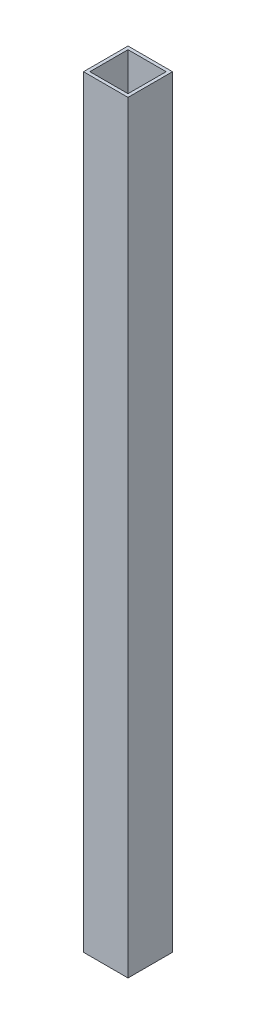
ISO-10303-21;
HEADER;
FILE_DESCRIPTION(('STEP AP214'),'2;1');
FILE_NAME('part.step','',(''),(''),'','','');
FILE_SCHEMA(('AUTOMOTIVE_DESIGN { 1 0 10303 214 1 1 1 1 }'));
ENDSEC;
DATA;
#1=APPLICATION_CONTEXT('core data for automotive mechanical design processes');
#2=APPLICATION_PROTOCOL_DEFINITION('international standard','automotive_design',2000,#1);
#3=PRODUCT_CONTEXT('',#1,'mechanical');
#4=PRODUCT('Part','Part','',(#3));
#5=PRODUCT_RELATED_PRODUCT_CATEGORY('part','',(#4));
#6=PRODUCT_DEFINITION_FORMATION('','',#4);
#7=PRODUCT_DEFINITION_CONTEXT('part definition',#1,'design');
#8=PRODUCT_DEFINITION('design','',#6,#7);
#9=PRODUCT_DEFINITION_SHAPE('','',#8);
#10=(LENGTH_UNIT() NAMED_UNIT(*) SI_UNIT(.MILLI.,.METRE.));
#11=(NAMED_UNIT(*) PLANE_ANGLE_UNIT() SI_UNIT($,.RADIAN.));
#12=(NAMED_UNIT(*) SI_UNIT($,.STERADIAN.) SOLID_ANGLE_UNIT());
#13=UNCERTAINTY_MEASURE_WITH_UNIT(LENGTH_MEASURE(1.E-05),#10,'distance_accuracy_value','');
#14=(GEOMETRIC_REPRESENTATION_CONTEXT(3) GLOBAL_UNCERTAINTY_ASSIGNED_CONTEXT((#13)) GLOBAL_UNIT_ASSIGNED_CONTEXT((#10,
#11,#12)) REPRESENTATION_CONTEXT('',''));
#15=CARTESIAN_POINT('',(0.,0.,0.));
#16=DIRECTION('',(0.,0.,1.));
#17=DIRECTION('',(1.,0.,0.));
#18=AXIS2_PLACEMENT_3D('',#15,#16,#17);
#19=CARTESIAN_POINT('',(22.225,0.,22.225));
#20=DIRECTION('',(1.,0.,0.));
#21=DIRECTION('',(0.,0.,-1.));
#22=AXIS2_PLACEMENT_3D('',#19,#20,#21);
#23=PLANE('',#22);
#24=DIRECTION('',(0.,1.,0.));
#25=VECTOR('',#24,1.);
#26=CARTESIAN_POINT('',(22.225,0.,22.225));
#27=LINE('',#26,#25);
#28=CARTESIAN_POINT('',(22.225,0.,22.225));
#29=VERTEX_POINT('',#28);
#30=CARTESIAN_POINT('',(22.225,762.,22.225));
#31=VERTEX_POINT('',#30);
#32=EDGE_CURVE('E113',#29,#31,#27,.T.);
#33=ORIENTED_EDGE('',*,*,#32,.F.);
#34=DIRECTION('',(0.,0.,1.));
#35=VECTOR('',#34,1.);
#36=CARTESIAN_POINT('',(22.225,0.,0.));
#37=LINE('',#36,#35);
#38=CARTESIAN_POINT('',(22.225,0.,-22.225));
#39=VERTEX_POINT('',#38);
#40=EDGE_CURVE('E135',#29,#39,#37,.F.);
#41=ORIENTED_EDGE('',*,*,#40,.T.);
#42=DIRECTION('',(0.,1.,0.));
#43=VECTOR('',#42,1.);
#44=CARTESIAN_POINT('',(22.225,0.,-22.225));
#45=LINE('',#44,#43);
#46=CARTESIAN_POINT('',(22.225,762.,-22.225));
#47=VERTEX_POINT('',#46);
#48=EDGE_CURVE('E130',#47,#39,#45,.F.);
#49=ORIENTED_EDGE('',*,*,#48,.F.);
#50=DIRECTION('',(0.,0.,1.));
#51=VECTOR('',#50,1.);
#52=CARTESIAN_POINT('',(22.225,762.,0.));
#53=LINE('',#52,#51);
#54=EDGE_CURVE('E105',#31,#47,#53,.F.);
#55=ORIENTED_EDGE('',*,*,#54,.F.);
#56=EDGE_LOOP('',(#33,#41,#49,#55));
#57=FACE_BOUND('',#56,.T.);
#58=ADVANCED_FACE('F16',(#57),#23,.T.);
#59=CARTESIAN_POINT('',(-19.05,0.,-19.05));
#60=DIRECTION('',(0.,0.,1.));
#61=DIRECTION('',(1.,0.,0.));
#62=AXIS2_PLACEMENT_3D('',#59,#60,#61);
#63=PLANE('',#62);
#64=DIRECTION('',(0.,1.,0.));
#65=VECTOR('',#64,1.);
#66=CARTESIAN_POINT('',(-19.05,0.,-19.05));
#67=LINE('',#66,#65);
#68=CARTESIAN_POINT('',(-19.05,0.,-19.05));
#69=VERTEX_POINT('',#68);
#70=CARTESIAN_POINT('',(-19.05,762.,-19.05));
#71=VERTEX_POINT('',#70);
#72=EDGE_CURVE('E90',#69,#71,#67,.T.);
#73=ORIENTED_EDGE('',*,*,#72,.F.);
#74=DIRECTION('',(1.,0.,0.));
#75=VECTOR('',#74,1.);
#76=CARTESIAN_POINT('',(0.,0.,-19.05));
#77=LINE('',#76,#75);
#78=CARTESIAN_POINT('',(19.05,0.,-19.05));
#79=VERTEX_POINT('',#78);
#80=EDGE_CURVE('E138',#69,#79,#77,.T.);
#81=ORIENTED_EDGE('',*,*,#80,.T.);
#82=DIRECTION('',(0.,1.,0.));
#83=VECTOR('',#82,1.);
#84=CARTESIAN_POINT('',(19.05,0.,-19.05));
#85=LINE('',#84,#83);
#86=CARTESIAN_POINT('',(19.05,762.,-19.05));
#87=VERTEX_POINT('',#86);
#88=EDGE_CURVE('E19',#87,#79,#85,.F.);
#89=ORIENTED_EDGE('',*,*,#88,.F.);
#90=DIRECTION('',(1.,0.,0.));
#91=VECTOR('',#90,1.);
#92=CARTESIAN_POINT('',(0.,762.,-19.05));
#93=LINE('',#92,#91);
#94=EDGE_CURVE('E104',#71,#87,#93,.T.);
#95=ORIENTED_EDGE('',*,*,#94,.F.);
#96=EDGE_LOOP('',(#73,#81,#89,#95));
#97=FACE_BOUND('',#96,.T.);
#98=ADVANCED_FACE('F124',(#97),#63,.T.);
#99=CARTESIAN_POINT('',(19.05,0.,-19.05));
#100=DIRECTION('',(-1.,0.,0.));
#101=DIRECTION('',(0.,0.,1.));
#102=AXIS2_PLACEMENT_3D('',#99,#100,#101);
#103=PLANE('',#102);
#104=ORIENTED_EDGE('',*,*,#88,.T.);
#105=DIRECTION('',(0.,0.,1.));
#106=VECTOR('',#105,1.);
#107=CARTESIAN_POINT('',(19.05,0.,0.));
#108=LINE('',#107,#106);
#109=CARTESIAN_POINT('',(19.05,0.,19.05));
#110=VERTEX_POINT('',#109);
#111=EDGE_CURVE('E87',#79,#110,#108,.T.);
#112=ORIENTED_EDGE('',*,*,#111,.T.);
#113=DIRECTION('',(0.,1.,0.));
#114=VECTOR('',#113,1.);
#115=CARTESIAN_POINT('',(19.05,0.,19.05));
#116=LINE('',#115,#114);
#117=CARTESIAN_POINT('',(19.05,762.,19.05));
#118=VERTEX_POINT('',#117);
#119=EDGE_CURVE('E79',#118,#110,#116,.F.);
#120=ORIENTED_EDGE('',*,*,#119,.F.);
#121=DIRECTION('',(0.,0.,1.));
#122=VECTOR('',#121,1.);
#123=CARTESIAN_POINT('',(19.05,762.,0.));
#124=LINE('',#123,#122);
#125=EDGE_CURVE('E84',#87,#118,#124,.T.);
#126=ORIENTED_EDGE('',*,*,#125,.F.);
#127=EDGE_LOOP('',(#104,#112,#120,#126));
#128=FACE_BOUND('',#127,.T.);
#129=ADVANCED_FACE('F82',(#128),#103,.T.);
#130=CARTESIAN_POINT('',(19.05,0.,19.05));
#131=DIRECTION('',(0.,0.,-1.));
#132=DIRECTION('',(-1.,0.,0.));
#133=AXIS2_PLACEMENT_3D('',#130,#131,#132);
#134=PLANE('',#133);
#135=ORIENTED_EDGE('',*,*,#119,.T.);
#136=DIRECTION('',(1.,0.,0.));
#137=VECTOR('',#136,1.);
#138=CARTESIAN_POINT('',(0.,0.,19.05));
#139=LINE('',#138,#137);
#140=CARTESIAN_POINT('',(-19.05,0.,19.05));
#141=VERTEX_POINT('',#140);
#142=EDGE_CURVE('E141',#110,#141,#139,.F.);
#143=ORIENTED_EDGE('',*,*,#142,.T.);
#144=DIRECTION('',(0.,1.,0.));
#145=VECTOR('',#144,1.);
#146=CARTESIAN_POINT('',(-19.05,0.,19.05));
#147=LINE('',#146,#145);
#148=CARTESIAN_POINT('',(-19.05,762.,19.05));
#149=VERTEX_POINT('',#148);
#150=EDGE_CURVE('E95',#149,#141,#147,.F.);
#151=ORIENTED_EDGE('',*,*,#150,.F.);
#152=DIRECTION('',(1.,0.,0.));
#153=VECTOR('',#152,1.);
#154=CARTESIAN_POINT('',(0.,762.,19.05));
#155=LINE('',#154,#153);
#156=EDGE_CURVE('E92',#118,#149,#155,.F.);
#157=ORIENTED_EDGE('',*,*,#156,.F.);
#158=EDGE_LOOP('',(#135,#143,#151,#157));
#159=FACE_BOUND('',#158,.T.);
#160=ADVANCED_FACE('F93',(#159),#134,.T.);
#161=CARTESIAN_POINT('',(-19.05,0.,19.05));
#162=DIRECTION('',(1.,0.,0.));
#163=DIRECTION('',(0.,0.,-1.));
#164=AXIS2_PLACEMENT_3D('',#161,#162,#163);
#165=PLANE('',#164);
#166=ORIENTED_EDGE('',*,*,#150,.T.);
#167=DIRECTION('',(0.,0.,1.));
#168=VECTOR('',#167,1.);
#169=CARTESIAN_POINT('',(-19.05,0.,0.));
#170=LINE('',#169,#168);
#171=EDGE_CURVE('E121',#141,#69,#170,.F.);
#172=ORIENTED_EDGE('',*,*,#171,.T.);
#173=ORIENTED_EDGE('',*,*,#72,.T.);
#174=DIRECTION('',(0.,0.,1.));
#175=VECTOR('',#174,1.);
#176=CARTESIAN_POINT('',(-19.05,762.,0.));
#177=LINE('',#176,#175);
#178=EDGE_CURVE('E99',#149,#71,#177,.F.);
#179=ORIENTED_EDGE('',*,*,#178,.F.);
#180=EDGE_LOOP('',(#166,#172,#173,#179));
#181=FACE_BOUND('',#180,.T.);
#182=ADVANCED_FACE('F119',(#181),#165,.T.);
#183=CARTESIAN_POINT('',(-22.225,0.,22.225));
#184=DIRECTION('',(0.,0.,1.));
#185=DIRECTION('',(1.,0.,0.));
#186=AXIS2_PLACEMENT_3D('',#183,#184,#185);
#187=PLANE('',#186);
#188=DIRECTION('',(0.,1.,0.));
#189=VECTOR('',#188,1.);
#190=CARTESIAN_POINT('',(-22.225,0.,22.225));
#191=LINE('',#190,#189);
#192=CARTESIAN_POINT('',(-22.225,0.,22.225));
#193=VERTEX_POINT('',#192);
#194=CARTESIAN_POINT('',(-22.225,762.,22.225));
#195=VERTEX_POINT('',#194);
#196=EDGE_CURVE('E144',#193,#195,#191,.T.);
#197=ORIENTED_EDGE('',*,*,#196,.F.);
#198=DIRECTION('',(1.,0.,0.));
#199=VECTOR('',#198,1.);
#200=CARTESIAN_POINT('',(0.,0.,22.225));
#201=LINE('',#200,#199);
#202=EDGE_CURVE('E132',#193,#29,#201,.T.);
#203=ORIENTED_EDGE('',*,*,#202,.T.);
#204=ORIENTED_EDGE('',*,*,#32,.T.);
#205=DIRECTION('',(1.,0.,0.));
#206=VECTOR('',#205,1.);
#207=CARTESIAN_POINT('',(0.,762.,22.225));
#208=LINE('',#207,#206);
#209=EDGE_CURVE('E107',#195,#31,#208,.T.);
#210=ORIENTED_EDGE('',*,*,#209,.F.);
#211=EDGE_LOOP('',(#197,#203,#204,#210));
#212=FACE_BOUND('',#211,.T.);
#213=ADVANCED_FACE('F163',(#212),#187,.T.);
#214=CARTESIAN_POINT('',(0.,762.,0.));
#215=DIRECTION('',(0.,1.,0.));
#216=DIRECTION('',(0.,0.,1.));
#217=AXIS2_PLACEMENT_3D('',#214,#215,#216);
#218=PLANE('',#217);
#219=ORIENTED_EDGE('',*,*,#178,.T.);
#220=ORIENTED_EDGE('',*,*,#94,.T.);
#221=ORIENTED_EDGE('',*,*,#125,.T.);
#222=ORIENTED_EDGE('',*,*,#156,.T.);
#223=EDGE_LOOP('',(#219,#220,#221,#222));
#224=FACE_BOUND('',#223,.T.);
#225=DIRECTION('',(-1.,0.,0.));
#226=VECTOR('',#225,1.);
#227=CARTESIAN_POINT('',(22.225,762.,-22.225));
#228=LINE('',#227,#226);
#229=CARTESIAN_POINT('',(-22.225,762.,-22.225));
#230=VERTEX_POINT('',#229);
#231=EDGE_CURVE('E125',#230,#47,#228,.F.);
#232=ORIENTED_EDGE('',*,*,#231,.F.);
#233=DIRECTION('',(0.,0.,1.));
#234=VECTOR('',#233,1.);
#235=CARTESIAN_POINT('',(-22.225,762.,-22.225));
#236=LINE('',#235,#234);
#237=EDGE_CURVE('E147',#195,#230,#236,.F.);
#238=ORIENTED_EDGE('',*,*,#237,.F.);
#239=ORIENTED_EDGE('',*,*,#209,.T.);
#240=ORIENTED_EDGE('',*,*,#54,.T.);
#241=EDGE_LOOP('',(#232,#238,#239,#240));
#242=FACE_BOUND('',#241,.T.);
#243=ADVANCED_FACE('F101',(#224,#242),#218,.T.);
#244=CARTESIAN_POINT('',(22.225,0.,-22.225));
#245=DIRECTION('',(0.,0.,-1.));
#246=DIRECTION('',(-1.,0.,0.));
#247=AXIS2_PLACEMENT_3D('',#244,#245,#246);
#248=PLANE('',#247);
#249=ORIENTED_EDGE('',*,*,#48,.T.);
#250=DIRECTION('',(1.,0.,0.));
#251=VECTOR('',#250,1.);
#252=CARTESIAN_POINT('',(0.,0.,-22.225));
#253=LINE('',#252,#251);
#254=CARTESIAN_POINT('',(-22.225,0.,-22.225));
#255=VERTEX_POINT('',#254);
#256=EDGE_CURVE('E34',#39,#255,#253,.F.);
#257=ORIENTED_EDGE('',*,*,#256,.T.);
#258=DIRECTION('',(0.,1.,0.));
#259=VECTOR('',#258,1.);
#260=CARTESIAN_POINT('',(-22.225,0.,-22.225));
#261=LINE('',#260,#259);
#262=EDGE_CURVE('E25',#230,#255,#261,.F.);
#263=ORIENTED_EDGE('',*,*,#262,.F.);
#264=ORIENTED_EDGE('',*,*,#231,.T.);
#265=EDGE_LOOP('',(#249,#257,#263,#264));
#266=FACE_BOUND('',#265,.T.);
#267=ADVANCED_FACE('F154',(#266),#248,.T.);
#268=CARTESIAN_POINT('',(0.,0.,0.));
#269=DIRECTION('',(0.,1.,0.));
#270=DIRECTION('',(0.,0.,1.));
#271=AXIS2_PLACEMENT_3D('',#268,#269,#270);
#272=PLANE('',#271);
#273=ORIENTED_EDGE('',*,*,#142,.F.);
#274=ORIENTED_EDGE('',*,*,#111,.F.);
#275=ORIENTED_EDGE('',*,*,#80,.F.);
#276=ORIENTED_EDGE('',*,*,#171,.F.);
#277=EDGE_LOOP('',(#273,#274,#275,#276));
#278=FACE_BOUND('',#277,.T.);
#279=ORIENTED_EDGE('',*,*,#40,.F.);
#280=ORIENTED_EDGE('',*,*,#202,.F.);
#281=DIRECTION('',(0.,0.,1.));
#282=VECTOR('',#281,1.);
#283=CARTESIAN_POINT('',(-22.225,0.,-22.225));
#284=LINE('',#283,#282);
#285=EDGE_CURVE('E11',#255,#193,#284,.T.);
#286=ORIENTED_EDGE('',*,*,#285,.F.);
#287=ORIENTED_EDGE('',*,*,#256,.F.);
#288=EDGE_LOOP('',(#279,#280,#286,#287));
#289=FACE_BOUND('',#288,.T.);
#290=ADVANCED_FACE('F161',(#278,#289),#272,.F.);
#291=CARTESIAN_POINT('',(-22.225,0.,-22.225));
#292=DIRECTION('',(-1.,0.,0.));
#293=DIRECTION('',(0.,0.,1.));
#294=AXIS2_PLACEMENT_3D('',#291,#292,#293);
#295=PLANE('',#294);
#296=ORIENTED_EDGE('',*,*,#262,.T.);
#297=ORIENTED_EDGE('',*,*,#285,.T.);
#298=ORIENTED_EDGE('',*,*,#196,.T.);
#299=ORIENTED_EDGE('',*,*,#237,.T.);
#300=EDGE_LOOP('',(#296,#297,#298,#299));
#301=FACE_BOUND('',#300,.T.);
#302=ADVANCED_FACE('F152',(#301),#295,.T.);
#303=CLOSED_SHELL('',(#58,#98,#129,#160,#182,#213,#243,#267,#290,#302));
#304=MANIFOLD_SOLID_BREP('B1',#303);
#305=ADVANCED_BREP_SHAPE_REPRESENTATION('',(#18,#304),#14);
#306=SHAPE_DEFINITION_REPRESENTATION(#9,#305);
ENDSEC;
END-ISO-10303-21;
